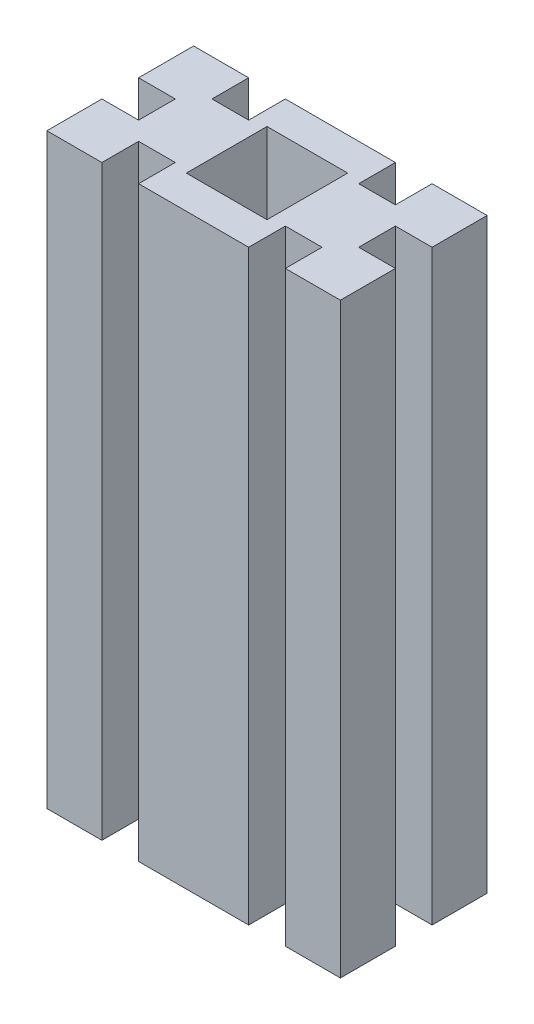
ISO-10303-21;
HEADER;
FILE_DESCRIPTION(('STEP AP214'),'2;1');
FILE_NAME('part.step','',(''),(''),'','','');
FILE_SCHEMA(('AUTOMOTIVE_DESIGN { 1 0 10303 214 1 1 1 1 }'));
ENDSEC;
DATA;
#1=APPLICATION_CONTEXT('core data for automotive mechanical design processes');
#2=APPLICATION_PROTOCOL_DEFINITION('international standard','automotive_design',2000,#1);
#3=PRODUCT_CONTEXT('',#1,'mechanical');
#4=PRODUCT('Part','Part','',(#3));
#5=PRODUCT_RELATED_PRODUCT_CATEGORY('part','',(#4));
#6=PRODUCT_DEFINITION_FORMATION('','',#4);
#7=PRODUCT_DEFINITION_CONTEXT('part definition',#1,'design');
#8=PRODUCT_DEFINITION('design','',#6,#7);
#9=PRODUCT_DEFINITION_SHAPE('','',#8);
#10=(LENGTH_UNIT() NAMED_UNIT(*) SI_UNIT(.MILLI.,.METRE.));
#11=(NAMED_UNIT(*) PLANE_ANGLE_UNIT() SI_UNIT($,.RADIAN.));
#12=(NAMED_UNIT(*) SI_UNIT($,.STERADIAN.) SOLID_ANGLE_UNIT());
#13=UNCERTAINTY_MEASURE_WITH_UNIT(LENGTH_MEASURE(1.E-05),#10,'distance_accuracy_value','');
#14=(GEOMETRIC_REPRESENTATION_CONTEXT(3) GLOBAL_UNCERTAINTY_ASSIGNED_CONTEXT((#13)) GLOBAL_UNIT_ASSIGNED_CONTEXT((#10,
#11,#12)) REPRESENTATION_CONTEXT('',''));
#15=CARTESIAN_POINT('',(0.,0.,0.));
#16=DIRECTION('',(0.,0.,1.));
#17=DIRECTION('',(1.,0.,0.));
#18=AXIS2_PLACEMENT_3D('',#15,#16,#17);
#19=CARTESIAN_POINT('',(-20.,80.,10.));
#20=DIRECTION('',(1.,0.,0.));
#21=DIRECTION('',(0.,0.,-1.));
#22=AXIS2_PLACEMENT_3D('',#19,#20,#21);
#23=PLANE('',#22);
#24=DIRECTION('',(0.,0.,1.));
#25=VECTOR('',#24,1.);
#26=CARTESIAN_POINT('',(-20.,0.,10.));
#27=LINE('',#26,#25);
#28=CARTESIAN_POINT('',(-20.,0.,-10.));
#29=VERTEX_POINT('',#28);
#30=CARTESIAN_POINT('',(-20.,0.,-2.5));
#31=VERTEX_POINT('',#30);
#32=EDGE_CURVE('E315',#29,#31,#27,.T.);
#33=ORIENTED_EDGE('',*,*,#32,.T.);
#34=DIRECTION('',(0.,1.,0.));
#35=VECTOR('',#34,1.);
#36=CARTESIAN_POINT('',(-20.,0.,-2.5));
#37=LINE('',#36,#35);
#38=CARTESIAN_POINT('',(-20.,80.,-2.5));
#39=VERTEX_POINT('',#38);
#40=EDGE_CURVE('E353',#31,#39,#37,.T.);
#41=ORIENTED_EDGE('',*,*,#40,.T.);
#42=DIRECTION('',(0.,0.,1.));
#43=VECTOR('',#42,1.);
#44=CARTESIAN_POINT('',(-20.,80.,10.));
#45=LINE('',#44,#43);
#46=CARTESIAN_POINT('',(-20.,80.,-10.));
#47=VERTEX_POINT('',#46);
#48=EDGE_CURVE('E334',#47,#39,#45,.T.);
#49=ORIENTED_EDGE('',*,*,#48,.F.);
#50=DIRECTION('',(0.,-1.,0.));
#51=VECTOR('',#50,1.);
#52=CARTESIAN_POINT('',(-20.,80.,-10.));
#53=LINE('',#52,#51);
#54=EDGE_CURVE('E278',#47,#29,#53,.T.);
#55=ORIENTED_EDGE('',*,*,#54,.T.);
#56=EDGE_LOOP('',(#33,#41,#49,#55));
#57=FACE_BOUND('',#56,.T.);
#58=ADVANCED_FACE('F32',(#57),#23,.F.);
#59=CARTESIAN_POINT('',(20.,80.,9.99999999999999));
#60=DIRECTION('',(0.,0.,-1.));
#61=DIRECTION('',(-1.,0.,0.));
#62=AXIS2_PLACEMENT_3D('',#59,#60,#61);
#63=PLANE('',#62);
#64=DIRECTION('',(1.,0.,0.));
#65=VECTOR('',#64,1.);
#66=CARTESIAN_POINT('',(20.,0.,9.99999999999999));
#67=LINE('',#66,#65);
#68=CARTESIAN_POINT('',(-20.,0.,10.));
#69=VERTEX_POINT('',#68);
#70=CARTESIAN_POINT('',(-12.5,0.,10.));
#71=VERTEX_POINT('',#70);
#72=EDGE_CURVE('E303',#69,#71,#67,.T.);
#73=ORIENTED_EDGE('',*,*,#72,.T.);
#74=DIRECTION('',(0.,1.,0.));
#75=VECTOR('',#74,1.);
#76=CARTESIAN_POINT('',(-12.5,0.,10.));
#77=LINE('',#76,#75);
#78=CARTESIAN_POINT('',(-12.5,80.,10.));
#79=VERTEX_POINT('',#78);
#80=EDGE_CURVE('E408',#71,#79,#77,.T.);
#81=ORIENTED_EDGE('',*,*,#80,.T.);
#82=DIRECTION('',(1.,0.,0.));
#83=VECTOR('',#82,1.);
#84=CARTESIAN_POINT('',(20.,80.,9.99999999999999));
#85=LINE('',#84,#83);
#86=CARTESIAN_POINT('',(-20.,80.,10.));
#87=VERTEX_POINT('',#86);
#88=EDGE_CURVE('E329',#87,#79,#85,.T.);
#89=ORIENTED_EDGE('',*,*,#88,.F.);
#90=DIRECTION('',(0.,-1.,0.));
#91=VECTOR('',#90,1.);
#92=CARTESIAN_POINT('',(-20.,80.,10.));
#93=LINE('',#92,#91);
#94=EDGE_CURVE('E11',#87,#69,#93,.T.);
#95=ORIENTED_EDGE('',*,*,#94,.T.);
#96=EDGE_LOOP('',(#73,#81,#89,#95));
#97=FACE_BOUND('',#96,.T.);
#98=ADVANCED_FACE('F546',(#97),#63,.F.);
#99=CARTESIAN_POINT('',(-7.5,80.,10.));
#100=VERTEX_POINT('',#99);
#101=CARTESIAN_POINT('',(7.5,80.,10.));
#102=VERTEX_POINT('',#101);
#103=EDGE_CURVE('E332',#100,#102,#85,.T.);
#104=ORIENTED_EDGE('',*,*,#103,.F.);
#105=DIRECTION('',(0.,1.,0.));
#106=VECTOR('',#105,1.);
#107=CARTESIAN_POINT('',(-7.5,0.,10.));
#108=LINE('',#107,#106);
#109=CARTESIAN_POINT('',(-7.5,0.,10.));
#110=VERTEX_POINT('',#109);
#111=EDGE_CURVE('E410',#110,#100,#108,.T.);
#112=ORIENTED_EDGE('',*,*,#111,.F.);
#113=CARTESIAN_POINT('',(7.5,0.,10.));
#114=VERTEX_POINT('',#113);
#115=EDGE_CURVE('E309',#110,#114,#67,.T.);
#116=ORIENTED_EDGE('',*,*,#115,.T.);
#117=DIRECTION('',(0.,1.,0.));
#118=VECTOR('',#117,1.);
#119=CARTESIAN_POINT('',(7.5,0.,10.));
#120=LINE('',#119,#118);
#121=EDGE_CURVE('E390',#114,#102,#120,.T.);
#122=ORIENTED_EDGE('',*,*,#121,.T.);
#123=EDGE_LOOP('',(#104,#112,#116,#122));
#124=FACE_BOUND('',#123,.T.);
#125=ADVANCED_FACE('F534',(#124),#63,.F.);
#126=CARTESIAN_POINT('',(20.,80.,9.99999999999999));
#127=DIRECTION('',(-1.,0.,0.));
#128=DIRECTION('',(0.,0.,1.));
#129=AXIS2_PLACEMENT_3D('',#126,#127,#128);
#130=PLANE('',#129);
#131=DIRECTION('',(0.,0.,-1.));
#132=VECTOR('',#131,1.);
#133=CARTESIAN_POINT('',(20.,80.,9.99999999999999));
#134=LINE('',#133,#132);
#135=CARTESIAN_POINT('',(20.,80.,-2.5));
#136=VERTEX_POINT('',#135);
#137=CARTESIAN_POINT('',(20.,80.,-10.));
#138=VERTEX_POINT('',#137);
#139=EDGE_CURVE('E328',#136,#138,#134,.T.);
#140=ORIENTED_EDGE('',*,*,#139,.F.);
#141=DIRECTION('',(0.,1.,0.));
#142=VECTOR('',#141,1.);
#143=CARTESIAN_POINT('',(20.,0.,-2.5));
#144=LINE('',#143,#142);
#145=CARTESIAN_POINT('',(20.,0.,-2.5));
#146=VERTEX_POINT('',#145);
#147=EDGE_CURVE('E365',#146,#136,#144,.T.);
#148=ORIENTED_EDGE('',*,*,#147,.F.);
#149=DIRECTION('',(0.,0.,-1.));
#150=VECTOR('',#149,1.);
#151=CARTESIAN_POINT('',(20.,0.,9.99999999999999));
#152=LINE('',#151,#150);
#153=CARTESIAN_POINT('',(20.,0.,-10.));
#154=VERTEX_POINT('',#153);
#155=EDGE_CURVE('E302',#146,#154,#152,.T.);
#156=ORIENTED_EDGE('',*,*,#155,.T.);
#157=DIRECTION('',(0.,-1.,0.));
#158=VECTOR('',#157,1.);
#159=CARTESIAN_POINT('',(20.,80.,-10.));
#160=LINE('',#159,#158);
#161=EDGE_CURVE('E281',#138,#154,#160,.T.);
#162=ORIENTED_EDGE('',*,*,#161,.F.);
#163=EDGE_LOOP('',(#140,#148,#156,#162));
#164=FACE_BOUND('',#163,.T.);
#165=ADVANCED_FACE('F515',(#164),#130,.F.);
#166=CARTESIAN_POINT('',(20.,80.,-10.));
#167=DIRECTION('',(0.,0.,1.));
#168=DIRECTION('',(1.,0.,0.));
#169=AXIS2_PLACEMENT_3D('',#166,#167,#168);
#170=PLANE('',#169);
#171=DIRECTION('',(-1.,0.,0.));
#172=VECTOR('',#171,1.);
#173=CARTESIAN_POINT('',(20.,0.,-10.));
#174=LINE('',#173,#172);
#175=CARTESIAN_POINT('',(12.5,0.,-10.));
#176=VERTEX_POINT('',#175);
#177=EDGE_CURVE('E269',#154,#176,#174,.T.);
#178=ORIENTED_EDGE('',*,*,#177,.T.);
#179=DIRECTION('',(0.,1.,0.));
#180=VECTOR('',#179,1.);
#181=CARTESIAN_POINT('',(12.5,0.,-10.));
#182=LINE('',#181,#180);
#183=CARTESIAN_POINT('',(12.5,80.,-10.));
#184=VERTEX_POINT('',#183);
#185=EDGE_CURVE('E377',#176,#184,#182,.T.);
#186=ORIENTED_EDGE('',*,*,#185,.T.);
#187=DIRECTION('',(-1.,0.,0.));
#188=VECTOR('',#187,1.);
#189=CARTESIAN_POINT('',(20.,80.,-10.));
#190=LINE('',#189,#188);
#191=EDGE_CURVE('E282',#138,#184,#190,.T.);
#192=ORIENTED_EDGE('',*,*,#191,.F.);
#193=ORIENTED_EDGE('',*,*,#161,.T.);
#194=EDGE_LOOP('',(#178,#186,#192,#193));
#195=FACE_BOUND('',#194,.T.);
#196=ADVANCED_FACE('F507',(#195),#170,.F.);
#197=CARTESIAN_POINT('',(-12.5,80.,-10.));
#198=VERTEX_POINT('',#197);
#199=EDGE_CURVE('E326',#198,#47,#190,.T.);
#200=ORIENTED_EDGE('',*,*,#199,.F.);
#201=DIRECTION('',(0.,1.,0.));
#202=VECTOR('',#201,1.);
#203=CARTESIAN_POINT('',(-12.5,0.,-10.));
#204=LINE('',#203,#202);
#205=CARTESIAN_POINT('',(-12.5,0.,-10.));
#206=VERTEX_POINT('',#205);
#207=EDGE_CURVE('E322',#206,#198,#204,.T.);
#208=ORIENTED_EDGE('',*,*,#207,.F.);
#209=EDGE_CURVE('E270',#206,#29,#174,.T.);
#210=ORIENTED_EDGE('',*,*,#209,.T.);
#211=ORIENTED_EDGE('',*,*,#54,.F.);
#212=EDGE_LOOP('',(#200,#208,#210,#211));
#213=FACE_BOUND('',#212,.T.);
#214=ADVANCED_FACE('F552',(#213),#170,.F.);
#215=CARTESIAN_POINT('',(-20.,80.,2.5));
#216=VERTEX_POINT('',#215);
#217=EDGE_CURVE('E273',#216,#87,#45,.T.);
#218=ORIENTED_EDGE('',*,*,#217,.F.);
#219=DIRECTION('',(0.,1.,0.));
#220=VECTOR('',#219,1.);
#221=CARTESIAN_POINT('',(-20.,0.,2.5));
#222=LINE('',#221,#220);
#223=CARTESIAN_POINT('',(-20.,0.,2.5));
#224=VERTEX_POINT('',#223);
#225=EDGE_CURVE('E433',#224,#216,#222,.T.);
#226=ORIENTED_EDGE('',*,*,#225,.F.);
#227=EDGE_CURVE('E318',#224,#69,#27,.T.);
#228=ORIENTED_EDGE('',*,*,#227,.T.);
#229=ORIENTED_EDGE('',*,*,#94,.F.);
#230=EDGE_LOOP('',(#218,#226,#228,#229));
#231=FACE_BOUND('',#230,.T.);
#232=ADVANCED_FACE('F34',(#231),#23,.F.);
#233=CARTESIAN_POINT('',(12.5,80.,10.));
#234=VERTEX_POINT('',#233);
#235=CARTESIAN_POINT('',(20.,80.,9.99999999999999));
#236=VERTEX_POINT('',#235);
#237=EDGE_CURVE('E333',#234,#236,#85,.T.);
#238=ORIENTED_EDGE('',*,*,#237,.F.);
#239=DIRECTION('',(0.,1.,0.));
#240=VECTOR('',#239,1.);
#241=CARTESIAN_POINT('',(12.5,0.,10.));
#242=LINE('',#241,#240);
#243=CARTESIAN_POINT('',(12.5,0.,10.));
#244=VERTEX_POINT('',#243);
#245=EDGE_CURVE('E383',#244,#234,#242,.T.);
#246=ORIENTED_EDGE('',*,*,#245,.F.);
#247=CARTESIAN_POINT('',(20.,0.,9.99999999999999));
#248=VERTEX_POINT('',#247);
#249=EDGE_CURVE('E299',#244,#248,#67,.T.);
#250=ORIENTED_EDGE('',*,*,#249,.T.);
#251=DIRECTION('',(0.,-1.,0.));
#252=VECTOR('',#251,1.);
#253=CARTESIAN_POINT('',(20.,80.,9.99999999999999));
#254=LINE('',#253,#252);
#255=EDGE_CURVE('E40',#236,#248,#254,.T.);
#256=ORIENTED_EDGE('',*,*,#255,.F.);
#257=EDGE_LOOP('',(#238,#246,#250,#256));
#258=FACE_BOUND('',#257,.T.);
#259=ADVANCED_FACE('F544',(#258),#63,.F.);
#260=CARTESIAN_POINT('',(20.,0.,2.5));
#261=VERTEX_POINT('',#260);
#262=EDGE_CURVE('E274',#248,#261,#152,.T.);
#263=ORIENTED_EDGE('',*,*,#262,.T.);
#264=DIRECTION('',(0.,1.,0.));
#265=VECTOR('',#264,1.);
#266=CARTESIAN_POINT('',(20.,0.,2.5));
#267=LINE('',#266,#265);
#268=CARTESIAN_POINT('',(20.,80.,2.5));
#269=VERTEX_POINT('',#268);
#270=EDGE_CURVE('E363',#261,#269,#267,.T.);
#271=ORIENTED_EDGE('',*,*,#270,.T.);
#272=EDGE_CURVE('E293',#236,#269,#134,.T.);
#273=ORIENTED_EDGE('',*,*,#272,.F.);
#274=ORIENTED_EDGE('',*,*,#255,.T.);
#275=EDGE_LOOP('',(#263,#271,#273,#274));
#276=FACE_BOUND('',#275,.T.);
#277=ADVANCED_FACE('F290',(#276),#130,.F.);
#278=CARTESIAN_POINT('',(7.50000000000001,80.,-10.));
#279=VERTEX_POINT('',#278);
#280=CARTESIAN_POINT('',(-7.50000000000001,80.,-10.));
#281=VERTEX_POINT('',#280);
#282=EDGE_CURVE('E261',#279,#281,#190,.T.);
#283=ORIENTED_EDGE('',*,*,#282,.F.);
#284=DIRECTION('',(0.,1.,0.));
#285=VECTOR('',#284,1.);
#286=CARTESIAN_POINT('',(7.50000000000001,0.,-10.));
#287=LINE('',#286,#285);
#288=CARTESIAN_POINT('',(7.50000000000001,0.,-10.));
#289=VERTEX_POINT('',#288);
#290=EDGE_CURVE('E245',#289,#279,#287,.T.);
#291=ORIENTED_EDGE('',*,*,#290,.F.);
#292=CARTESIAN_POINT('',(-7.50000000000001,0.,-10.));
#293=VERTEX_POINT('',#292);
#294=EDGE_CURVE('E259',#289,#293,#174,.T.);
#295=ORIENTED_EDGE('',*,*,#294,.T.);
#296=DIRECTION('',(0.,1.,0.));
#297=VECTOR('',#296,1.);
#298=CARTESIAN_POINT('',(-7.50000000000001,0.,-10.));
#299=LINE('',#298,#297);
#300=EDGE_CURVE('E341',#293,#281,#299,.T.);
#301=ORIENTED_EDGE('',*,*,#300,.T.);
#302=EDGE_LOOP('',(#283,#291,#295,#301));
#303=FACE_BOUND('',#302,.T.);
#304=ADVANCED_FACE('F257',(#303),#170,.F.);
#305=CARTESIAN_POINT('',(0.,80.,0.));
#306=DIRECTION('',(0.,1.,0.));
#307=DIRECTION('',(0.,0.,1.));
#308=AXIS2_PLACEMENT_3D('',#305,#306,#307);
#309=PLANE('',#308);
#310=DIRECTION('',(-1.,0.,0.));
#311=VECTOR('',#310,1.);
#312=CARTESIAN_POINT('',(-20.,80.,-2.5));
#313=LINE('',#312,#311);
#314=CARTESIAN_POINT('',(-15.,80.,-2.5));
#315=VERTEX_POINT('',#314);
#316=EDGE_CURVE('E441',#315,#39,#313,.T.);
#317=ORIENTED_EDGE('',*,*,#316,.F.);
#318=DIRECTION('',(0.,0.,-1.));
#319=VECTOR('',#318,1.);
#320=CARTESIAN_POINT('',(-15.,80.,-2.5));
#321=LINE('',#320,#319);
#322=CARTESIAN_POINT('',(-15.,80.,2.5));
#323=VERTEX_POINT('',#322);
#324=EDGE_CURVE('E444',#323,#315,#321,.T.);
#325=ORIENTED_EDGE('',*,*,#324,.F.);
#326=DIRECTION('',(1.,0.,0.));
#327=VECTOR('',#326,1.);
#328=CARTESIAN_POINT('',(-20.,80.,2.5));
#329=LINE('',#328,#327);
#330=EDGE_CURVE('E417',#216,#323,#329,.T.);
#331=ORIENTED_EDGE('',*,*,#330,.F.);
#332=ORIENTED_EDGE('',*,*,#217,.T.);
#333=ORIENTED_EDGE('',*,*,#88,.T.);
#334=DIRECTION('',(0.,0.,1.));
#335=VECTOR('',#334,1.);
#336=CARTESIAN_POINT('',(-12.5,80.,10.));
#337=LINE('',#336,#335);
#338=CARTESIAN_POINT('',(-12.5,80.,5.));
#339=VERTEX_POINT('',#338);
#340=EDGE_CURVE('E393',#339,#79,#337,.T.);
#341=ORIENTED_EDGE('',*,*,#340,.F.);
#342=DIRECTION('',(-1.,0.,0.));
#343=VECTOR('',#342,1.);
#344=CARTESIAN_POINT('',(-12.5,80.,5.));
#345=LINE('',#344,#343);
#346=CARTESIAN_POINT('',(-7.5,80.,5.));
#347=VERTEX_POINT('',#346);
#348=EDGE_CURVE('E418',#347,#339,#345,.T.);
#349=ORIENTED_EDGE('',*,*,#348,.F.);
#350=DIRECTION('',(0.,0.,-1.));
#351=VECTOR('',#350,1.);
#352=CARTESIAN_POINT('',(-7.5,80.,10.));
#353=LINE('',#352,#351);
#354=EDGE_CURVE('E422',#100,#347,#353,.T.);
#355=ORIENTED_EDGE('',*,*,#354,.F.);
#356=ORIENTED_EDGE('',*,*,#103,.T.);
#357=DIRECTION('',(0.,0.,1.));
#358=VECTOR('',#357,1.);
#359=CARTESIAN_POINT('',(7.5,80.,10.));
#360=LINE('',#359,#358);
#361=CARTESIAN_POINT('',(7.5,80.,5.));
#362=VERTEX_POINT('',#361);
#363=EDGE_CURVE('E394',#362,#102,#360,.T.);
#364=ORIENTED_EDGE('',*,*,#363,.F.);
#365=DIRECTION('',(-1.,0.,0.));
#366=VECTOR('',#365,1.);
#367=CARTESIAN_POINT('',(12.5,80.,5.));
#368=LINE('',#367,#366);
#369=CARTESIAN_POINT('',(12.5,80.,5.));
#370=VERTEX_POINT('',#369);
#371=EDGE_CURVE('E397',#370,#362,#368,.T.);
#372=ORIENTED_EDGE('',*,*,#371,.F.);
#373=DIRECTION('',(0.,0.,-1.));
#374=VECTOR('',#373,1.);
#375=CARTESIAN_POINT('',(12.5,80.,10.));
#376=LINE('',#375,#374);
#377=EDGE_CURVE('E367',#234,#370,#376,.T.);
#378=ORIENTED_EDGE('',*,*,#377,.F.);
#379=ORIENTED_EDGE('',*,*,#237,.T.);
#380=ORIENTED_EDGE('',*,*,#272,.T.);
#381=DIRECTION('',(1.,0.,0.));
#382=VECTOR('',#381,1.);
#383=CARTESIAN_POINT('',(20.,80.,2.5));
#384=LINE('',#383,#382);
#385=CARTESIAN_POINT('',(15.,80.,2.5));
#386=VERTEX_POINT('',#385);
#387=EDGE_CURVE('E368',#386,#269,#384,.T.);
#388=ORIENTED_EDGE('',*,*,#387,.F.);
#389=DIRECTION('',(0.,0.,1.));
#390=VECTOR('',#389,1.);
#391=CARTESIAN_POINT('',(15.,80.,-2.5));
#392=LINE('',#391,#390);
#393=CARTESIAN_POINT('',(15.,80.,-2.5));
#394=VERTEX_POINT('',#393);
#395=EDGE_CURVE('E371',#394,#386,#392,.T.);
#396=ORIENTED_EDGE('',*,*,#395,.F.);
#397=DIRECTION('',(-1.,0.,0.));
#398=VECTOR('',#397,1.);
#399=CARTESIAN_POINT('',(20.,80.,-2.5));
#400=LINE('',#399,#398);
#401=EDGE_CURVE('E374',#136,#394,#400,.T.);
#402=ORIENTED_EDGE('',*,*,#401,.F.);
#403=ORIENTED_EDGE('',*,*,#139,.T.);
#404=ORIENTED_EDGE('',*,*,#191,.T.);
#405=DIRECTION('',(0.,0.,-1.));
#406=VECTOR('',#405,1.);
#407=CARTESIAN_POINT('',(12.5,80.,-10.));
#408=LINE('',#407,#406);
#409=CARTESIAN_POINT('',(12.5,80.,-5.00000000000001));
#410=VERTEX_POINT('',#409);
#411=EDGE_CURVE('E252',#410,#184,#408,.T.);
#412=ORIENTED_EDGE('',*,*,#411,.F.);
#413=DIRECTION('',(1.,0.,0.));
#414=VECTOR('',#413,1.);
#415=CARTESIAN_POINT('',(12.5,80.,-5.00000000000001));
#416=LINE('',#415,#414);
#417=CARTESIAN_POINT('',(7.5,80.,-5.00000000000001));
#418=VERTEX_POINT('',#417);
#419=EDGE_CURVE('E491',#418,#410,#416,.T.);
#420=ORIENTED_EDGE('',*,*,#419,.F.);
#421=DIRECTION('',(0.,0.,1.));
#422=VECTOR('',#421,1.);
#423=CARTESIAN_POINT('',(7.50000000000001,80.,-10.));
#424=LINE('',#423,#422);
#425=EDGE_CURVE('E463',#279,#418,#424,.T.);
#426=ORIENTED_EDGE('',*,*,#425,.F.);
#427=ORIENTED_EDGE('',*,*,#282,.T.);
#428=DIRECTION('',(0.,0.,-1.));
#429=VECTOR('',#428,1.);
#430=CARTESIAN_POINT('',(-7.50000000000001,80.,-10.));
#431=LINE('',#430,#429);
#432=CARTESIAN_POINT('',(-7.5,80.,-5.00000000000001));
#433=VERTEX_POINT('',#432);
#434=EDGE_CURVE('E344',#433,#281,#431,.T.);
#435=ORIENTED_EDGE('',*,*,#434,.F.);
#436=DIRECTION('',(1.,0.,0.));
#437=VECTOR('',#436,1.);
#438=CARTESIAN_POINT('',(-12.5,80.,-5.00000000000001));
#439=LINE('',#438,#437);
#440=CARTESIAN_POINT('',(-12.5,80.,-5.00000000000001));
#441=VERTEX_POINT('',#440);
#442=EDGE_CURVE('E347',#441,#433,#439,.T.);
#443=ORIENTED_EDGE('',*,*,#442,.F.);
#444=DIRECTION('',(0.,0.,1.));
#445=VECTOR('',#444,1.);
#446=CARTESIAN_POINT('',(-12.5,80.,-10.));
#447=LINE('',#446,#445);
#448=EDGE_CURVE('E350',#198,#441,#447,.T.);
#449=ORIENTED_EDGE('',*,*,#448,.F.);
#450=ORIENTED_EDGE('',*,*,#199,.T.);
#451=ORIENTED_EDGE('',*,*,#48,.T.);
#452=EDGE_LOOP('',(#317,#325,#331,#332,#333,#341,#349,#355,#356,#364,#372,#378,#379,#380,#388,
#396,#402,#403,#404,#412,#420,#426,#427,#435,#443,#449,#450,#451));
#453=FACE_BOUND('',#452,.T.);
#454=DIRECTION('',(0.,0.,1.));
#455=VECTOR('',#454,1.);
#456=CARTESIAN_POINT('',(-5.5,80.,-5.5));
#457=LINE('',#456,#455);
#458=CARTESIAN_POINT('',(-5.5,80.,-5.5));
#459=VERTEX_POINT('',#458);
#460=CARTESIAN_POINT('',(-5.5,80.,5.5));
#461=VERTEX_POINT('',#460);
#462=EDGE_CURVE('E47',#459,#461,#457,.T.);
#463=ORIENTED_EDGE('',*,*,#462,.F.);
#464=DIRECTION('',(-1.,0.,0.));
#465=VECTOR('',#464,1.);
#466=CARTESIAN_POINT('',(5.5,80.,-5.5));
#467=LINE('',#466,#465);
#468=CARTESIAN_POINT('',(5.5,80.,-5.5));
#469=VERTEX_POINT('',#468);
#470=EDGE_CURVE('E464',#469,#459,#467,.T.);
#471=ORIENTED_EDGE('',*,*,#470,.F.);
#472=DIRECTION('',(0.,0.,-1.));
#473=VECTOR('',#472,1.);
#474=CARTESIAN_POINT('',(5.5,80.,-5.5));
#475=LINE('',#474,#473);
#476=CARTESIAN_POINT('',(5.5,80.,5.5));
#477=VERTEX_POINT('',#476);
#478=EDGE_CURVE('E468',#477,#469,#475,.T.);
#479=ORIENTED_EDGE('',*,*,#478,.F.);
#480=DIRECTION('',(1.,0.,0.));
#481=VECTOR('',#480,1.);
#482=CARTESIAN_POINT('',(5.5,80.,5.5));
#483=LINE('',#482,#481);
#484=EDGE_CURVE('E471',#461,#477,#483,.T.);
#485=ORIENTED_EDGE('',*,*,#484,.F.);
#486=EDGE_LOOP('',(#463,#471,#479,#485));
#487=FACE_BOUND('',#486,.T.);
#488=ADVANCED_FACE('F510',(#453,#487),#309,.T.);
#489=CARTESIAN_POINT('',(0.,0.,0.));
#490=DIRECTION('',(0.,1.,0.));
#491=DIRECTION('',(0.,0.,1.));
#492=AXIS2_PLACEMENT_3D('',#489,#490,#491);
#493=PLANE('',#492);
#494=DIRECTION('',(0.,0.,-1.));
#495=VECTOR('',#494,1.);
#496=CARTESIAN_POINT('',(-15.,0.,-2.5));
#497=LINE('',#496,#495);
#498=CARTESIAN_POINT('',(-15.,0.,2.5));
#499=VERTEX_POINT('',#498);
#500=CARTESIAN_POINT('',(-15.,0.,-2.5));
#501=VERTEX_POINT('',#500);
#502=EDGE_CURVE('E55',#499,#501,#497,.T.);
#503=ORIENTED_EDGE('',*,*,#502,.T.);
#504=DIRECTION('',(-1.,0.,0.));
#505=VECTOR('',#504,1.);
#506=CARTESIAN_POINT('',(-20.,0.,-2.5));
#507=LINE('',#506,#505);
#508=EDGE_CURVE('E436',#501,#31,#507,.T.);
#509=ORIENTED_EDGE('',*,*,#508,.T.);
#510=ORIENTED_EDGE('',*,*,#32,.F.);
#511=ORIENTED_EDGE('',*,*,#209,.F.);
#512=DIRECTION('',(0.,0.,1.));
#513=VECTOR('',#512,1.);
#514=CARTESIAN_POINT('',(-12.5,0.,-10.));
#515=LINE('',#514,#513);
#516=CARTESIAN_POINT('',(-12.5,0.,-5.00000000000001));
#517=VERTEX_POINT('',#516);
#518=EDGE_CURVE('E346',#206,#517,#515,.T.);
#519=ORIENTED_EDGE('',*,*,#518,.T.);
#520=DIRECTION('',(1.,0.,0.));
#521=VECTOR('',#520,1.);
#522=CARTESIAN_POINT('',(-12.5,0.,-5.00000000000001));
#523=LINE('',#522,#521);
#524=CARTESIAN_POINT('',(-7.5,0.,-5.00000000000001));
#525=VERTEX_POINT('',#524);
#526=EDGE_CURVE('E355',#517,#525,#523,.T.);
#527=ORIENTED_EDGE('',*,*,#526,.T.);
#528=DIRECTION('',(0.,0.,-1.));
#529=VECTOR('',#528,1.);
#530=CARTESIAN_POINT('',(-7.50000000000001,0.,-10.));
#531=LINE('',#530,#529);
#532=EDGE_CURVE('E268',#525,#293,#531,.T.);
#533=ORIENTED_EDGE('',*,*,#532,.T.);
#534=ORIENTED_EDGE('',*,*,#294,.F.);
#535=DIRECTION('',(0.,0.,1.));
#536=VECTOR('',#535,1.);
#537=CARTESIAN_POINT('',(7.50000000000001,0.,-10.));
#538=LINE('',#537,#536);
#539=CARTESIAN_POINT('',(7.5,0.,-5.00000000000001));
#540=VERTEX_POINT('',#539);
#541=EDGE_CURVE('E241',#289,#540,#538,.T.);
#542=ORIENTED_EDGE('',*,*,#541,.T.);
#543=DIRECTION('',(1.,0.,0.));
#544=VECTOR('',#543,1.);
#545=CARTESIAN_POINT('',(12.5,0.,-5.00000000000001));
#546=LINE('',#545,#544);
#547=CARTESIAN_POINT('',(12.5,0.,-5.00000000000001));
#548=VERTEX_POINT('',#547);
#549=EDGE_CURVE('E251',#540,#548,#546,.T.);
#550=ORIENTED_EDGE('',*,*,#549,.T.);
#551=DIRECTION('',(0.,0.,-1.));
#552=VECTOR('',#551,1.);
#553=CARTESIAN_POINT('',(12.5,0.,-10.));
#554=LINE('',#553,#552);
#555=EDGE_CURVE('E262',#548,#176,#554,.T.);
#556=ORIENTED_EDGE('',*,*,#555,.T.);
#557=ORIENTED_EDGE('',*,*,#177,.F.);
#558=ORIENTED_EDGE('',*,*,#155,.F.);
#559=DIRECTION('',(-1.,0.,0.));
#560=VECTOR('',#559,1.);
#561=CARTESIAN_POINT('',(20.,0.,-2.5));
#562=LINE('',#561,#560);
#563=CARTESIAN_POINT('',(15.,0.,-2.5));
#564=VERTEX_POINT('',#563);
#565=EDGE_CURVE('E370',#146,#564,#562,.T.);
#566=ORIENTED_EDGE('',*,*,#565,.T.);
#567=DIRECTION('',(0.,0.,1.));
#568=VECTOR('',#567,1.);
#569=CARTESIAN_POINT('',(15.,0.,-2.5));
#570=LINE('',#569,#568);
#571=CARTESIAN_POINT('',(15.,0.,2.5));
#572=VERTEX_POINT('',#571);
#573=EDGE_CURVE('E379',#564,#572,#570,.T.);
#574=ORIENTED_EDGE('',*,*,#573,.T.);
#575=DIRECTION('',(1.,0.,0.));
#576=VECTOR('',#575,1.);
#577=CARTESIAN_POINT('',(20.,0.,2.5));
#578=LINE('',#577,#576);
#579=EDGE_CURVE('E301',#572,#261,#578,.T.);
#580=ORIENTED_EDGE('',*,*,#579,.T.);
#581=ORIENTED_EDGE('',*,*,#262,.F.);
#582=ORIENTED_EDGE('',*,*,#249,.F.);
#583=DIRECTION('',(0.,0.,-1.));
#584=VECTOR('',#583,1.);
#585=CARTESIAN_POINT('',(12.5,0.,10.));
#586=LINE('',#585,#584);
#587=CARTESIAN_POINT('',(12.5,0.,5.));
#588=VERTEX_POINT('',#587);
#589=EDGE_CURVE('E396',#244,#588,#586,.T.);
#590=ORIENTED_EDGE('',*,*,#589,.T.);
#591=DIRECTION('',(-1.,0.,0.));
#592=VECTOR('',#591,1.);
#593=CARTESIAN_POINT('',(12.5,0.,5.));
#594=LINE('',#593,#592);
#595=CARTESIAN_POINT('',(7.5,0.,5.));
#596=VERTEX_POINT('',#595);
#597=EDGE_CURVE('E404',#588,#596,#594,.T.);
#598=ORIENTED_EDGE('',*,*,#597,.T.);
#599=DIRECTION('',(0.,0.,1.));
#600=VECTOR('',#599,1.);
#601=CARTESIAN_POINT('',(7.5,0.,10.));
#602=LINE('',#601,#600);
#603=EDGE_CURVE('E386',#596,#114,#602,.T.);
#604=ORIENTED_EDGE('',*,*,#603,.T.);
#605=ORIENTED_EDGE('',*,*,#115,.F.);
#606=DIRECTION('',(0.,0.,-1.));
#607=VECTOR('',#606,1.);
#608=CARTESIAN_POINT('',(-7.5,0.,10.));
#609=LINE('',#608,#607);
#610=CARTESIAN_POINT('',(-7.5,0.,5.));
#611=VERTEX_POINT('',#610);
#612=EDGE_CURVE('E428',#110,#611,#609,.T.);
#613=ORIENTED_EDGE('',*,*,#612,.T.);
#614=DIRECTION('',(-1.,0.,0.));
#615=VECTOR('',#614,1.);
#616=CARTESIAN_POINT('',(-12.5,0.,5.));
#617=LINE('',#616,#615);
#618=CARTESIAN_POINT('',(-12.5,0.,5.));
#619=VERTEX_POINT('',#618);
#620=EDGE_CURVE('E411',#611,#619,#617,.T.);
#621=ORIENTED_EDGE('',*,*,#620,.T.);
#622=DIRECTION('',(0.,0.,1.));
#623=VECTOR('',#622,1.);
#624=CARTESIAN_POINT('',(-12.5,0.,10.));
#625=LINE('',#624,#623);
#626=EDGE_CURVE('E421',#619,#71,#625,.T.);
#627=ORIENTED_EDGE('',*,*,#626,.T.);
#628=ORIENTED_EDGE('',*,*,#72,.F.);
#629=ORIENTED_EDGE('',*,*,#227,.F.);
#630=DIRECTION('',(1.,0.,0.));
#631=VECTOR('',#630,1.);
#632=CARTESIAN_POINT('',(-20.,0.,2.5));
#633=LINE('',#632,#631);
#634=EDGE_CURVE('E443',#224,#499,#633,.T.);
#635=ORIENTED_EDGE('',*,*,#634,.T.);
#636=EDGE_LOOP('',(#503,#509,#510,#511,#519,#527,#533,#534,#542,#550,#556,#557,#558,#566,#574,
#580,#581,#582,#590,#598,#604,#605,#613,#621,#627,#628,#629,#635));
#637=FACE_BOUND('',#636,.T.);
#638=DIRECTION('',(-1.,0.,0.));
#639=VECTOR('',#638,1.);
#640=CARTESIAN_POINT('',(5.5,0.,-5.5));
#641=LINE('',#640,#639);
#642=CARTESIAN_POINT('',(5.5,0.,-5.5));
#643=VERTEX_POINT('',#642);
#644=CARTESIAN_POINT('',(-5.5,0.,-5.5));
#645=VERTEX_POINT('',#644);
#646=EDGE_CURVE('E457',#643,#645,#641,.T.);
#647=ORIENTED_EDGE('',*,*,#646,.T.);
#648=DIRECTION('',(0.,0.,1.));
#649=VECTOR('',#648,1.);
#650=CARTESIAN_POINT('',(-5.5,0.,-5.5));
#651=LINE('',#650,#649);
#652=CARTESIAN_POINT('',(-5.5,0.,5.5));
#653=VERTEX_POINT('',#652);
#654=EDGE_CURVE('E467',#645,#653,#651,.T.);
#655=ORIENTED_EDGE('',*,*,#654,.T.);
#656=DIRECTION('',(1.,0.,0.));
#657=VECTOR('',#656,1.);
#658=CARTESIAN_POINT('',(5.5,0.,5.5));
#659=LINE('',#658,#657);
#660=CARTESIAN_POINT('',(5.5,0.,5.5));
#661=VERTEX_POINT('',#660);
#662=EDGE_CURVE('E480',#653,#661,#659,.T.);
#663=ORIENTED_EDGE('',*,*,#662,.T.);
#664=DIRECTION('',(0.,0.,-1.));
#665=VECTOR('',#664,1.);
#666=CARTESIAN_POINT('',(5.5,0.,-5.5));
#667=LINE('',#666,#665);
#668=EDGE_CURVE('E477',#661,#643,#667,.T.);
#669=ORIENTED_EDGE('',*,*,#668,.T.);
#670=EDGE_LOOP('',(#647,#655,#663,#669));
#671=FACE_BOUND('',#670,.T.);
#672=ADVANCED_FACE('F265',(#637,#671),#493,.F.);
#673=CARTESIAN_POINT('',(-12.5,0.,-10.));
#674=DIRECTION('',(-1.,0.,0.));
#675=DIRECTION('',(0.,0.,1.));
#676=AXIS2_PLACEMENT_3D('',#673,#674,#675);
#677=PLANE('',#676);
#678=ORIENTED_EDGE('',*,*,#448,.T.);
#679=DIRECTION('',(0.,1.,0.));
#680=VECTOR('',#679,1.);
#681=CARTESIAN_POINT('',(-12.5,0.,-5.00000000000001));
#682=LINE('',#681,#680);
#683=EDGE_CURVE('E337',#517,#441,#682,.T.);
#684=ORIENTED_EDGE('',*,*,#683,.F.);
#685=ORIENTED_EDGE('',*,*,#518,.F.);
#686=ORIENTED_EDGE('',*,*,#207,.T.);
#687=EDGE_LOOP('',(#678,#684,#685,#686));
#688=FACE_BOUND('',#687,.T.);
#689=ADVANCED_FACE('F622',(#688),#677,.F.);
#690=CARTESIAN_POINT('',(-7.50000000000001,0.,-10.));
#691=DIRECTION('',(1.,0.,0.));
#692=DIRECTION('',(0.,0.,-1.));
#693=AXIS2_PLACEMENT_3D('',#690,#691,#692);
#694=PLANE('',#693);
#695=ORIENTED_EDGE('',*,*,#434,.T.);
#696=ORIENTED_EDGE('',*,*,#300,.F.);
#697=ORIENTED_EDGE('',*,*,#532,.F.);
#698=DIRECTION('',(0.,1.,0.));
#699=VECTOR('',#698,1.);
#700=CARTESIAN_POINT('',(-7.5,0.,-5.00000000000001));
#701=LINE('',#700,#699);
#702=EDGE_CURVE('E339',#525,#433,#701,.T.);
#703=ORIENTED_EDGE('',*,*,#702,.T.);
#704=EDGE_LOOP('',(#695,#696,#697,#703));
#705=FACE_BOUND('',#704,.T.);
#706=ADVANCED_FACE('F631',(#705),#694,.F.);
#707=CARTESIAN_POINT('',(-12.5,0.,-5.00000000000001));
#708=DIRECTION('',(0.,0.,1.));
#709=DIRECTION('',(1.,0.,0.));
#710=AXIS2_PLACEMENT_3D('',#707,#708,#709);
#711=PLANE('',#710);
#712=ORIENTED_EDGE('',*,*,#442,.T.);
#713=ORIENTED_EDGE('',*,*,#702,.F.);
#714=ORIENTED_EDGE('',*,*,#526,.F.);
#715=ORIENTED_EDGE('',*,*,#683,.T.);
#716=EDGE_LOOP('',(#712,#713,#714,#715));
#717=FACE_BOUND('',#716,.T.);
#718=ADVANCED_FACE('F641',(#717),#711,.F.);
#719=CARTESIAN_POINT('',(-5.5,0.,-5.5));
#720=DIRECTION('',(-1.,0.,0.));
#721=DIRECTION('',(0.,0.,1.));
#722=AXIS2_PLACEMENT_3D('',#719,#720,#721);
#723=PLANE('',#722);
#724=ORIENTED_EDGE('',*,*,#462,.T.);
#725=DIRECTION('',(0.,1.,0.));
#726=VECTOR('',#725,1.);
#727=CARTESIAN_POINT('',(-5.5,0.,5.5));
#728=LINE('',#727,#726);
#729=EDGE_CURVE('E454',#653,#461,#728,.T.);
#730=ORIENTED_EDGE('',*,*,#729,.F.);
#731=ORIENTED_EDGE('',*,*,#654,.F.);
#732=DIRECTION('',(0.,1.,0.));
#733=VECTOR('',#732,1.);
#734=CARTESIAN_POINT('',(-5.5,0.,-5.5));
#735=LINE('',#734,#733);
#736=EDGE_CURVE('E461',#645,#459,#735,.T.);
#737=ORIENTED_EDGE('',*,*,#736,.T.);
#738=EDGE_LOOP('',(#724,#730,#731,#737));
#739=FACE_BOUND('',#738,.T.);
#740=ADVANCED_FACE('F651',(#739),#723,.F.);
#741=CARTESIAN_POINT('',(5.5,0.,-5.5));
#742=DIRECTION('',(0.,0.,-1.));
#743=DIRECTION('',(-1.,0.,0.));
#744=AXIS2_PLACEMENT_3D('',#741,#742,#743);
#745=PLANE('',#744);
#746=ORIENTED_EDGE('',*,*,#470,.T.);
#747=ORIENTED_EDGE('',*,*,#736,.F.);
#748=ORIENTED_EDGE('',*,*,#646,.F.);
#749=DIRECTION('',(0.,1.,0.));
#750=VECTOR('',#749,1.);
#751=CARTESIAN_POINT('',(5.5,0.,-5.5));
#752=LINE('',#751,#750);
#753=EDGE_CURVE('E459',#643,#469,#752,.T.);
#754=ORIENTED_EDGE('',*,*,#753,.T.);
#755=EDGE_LOOP('',(#746,#747,#748,#754));
#756=FACE_BOUND('',#755,.T.);
#757=ADVANCED_FACE('F661',(#756),#745,.F.);
#758=CARTESIAN_POINT('',(5.5,0.,-5.5));
#759=DIRECTION('',(1.,0.,0.));
#760=DIRECTION('',(0.,0.,-1.));
#761=AXIS2_PLACEMENT_3D('',#758,#759,#760);
#762=PLANE('',#761);
#763=ORIENTED_EDGE('',*,*,#478,.T.);
#764=ORIENTED_EDGE('',*,*,#753,.F.);
#765=ORIENTED_EDGE('',*,*,#668,.F.);
#766=DIRECTION('',(0.,1.,0.));
#767=VECTOR('',#766,1.);
#768=CARTESIAN_POINT('',(5.5,0.,5.5));
#769=LINE('',#768,#767);
#770=EDGE_CURVE('E456',#661,#477,#769,.T.);
#771=ORIENTED_EDGE('',*,*,#770,.T.);
#772=EDGE_LOOP('',(#763,#764,#765,#771));
#773=FACE_BOUND('',#772,.T.);
#774=ADVANCED_FACE('F670',(#773),#762,.F.);
#775=CARTESIAN_POINT('',(5.5,0.,5.5));
#776=DIRECTION('',(0.,0.,1.));
#777=DIRECTION('',(1.,0.,0.));
#778=AXIS2_PLACEMENT_3D('',#775,#776,#777);
#779=PLANE('',#778);
#780=ORIENTED_EDGE('',*,*,#484,.T.);
#781=ORIENTED_EDGE('',*,*,#770,.F.);
#782=ORIENTED_EDGE('',*,*,#662,.F.);
#783=ORIENTED_EDGE('',*,*,#729,.T.);
#784=EDGE_LOOP('',(#780,#781,#782,#783));
#785=FACE_BOUND('',#784,.T.);
#786=ADVANCED_FACE('F680',(#785),#779,.F.);
#787=CARTESIAN_POINT('',(12.5,0.,-10.));
#788=DIRECTION('',(1.,0.,0.));
#789=DIRECTION('',(0.,0.,-1.));
#790=AXIS2_PLACEMENT_3D('',#787,#788,#789);
#791=PLANE('',#790);
#792=ORIENTED_EDGE('',*,*,#411,.T.);
#793=ORIENTED_EDGE('',*,*,#185,.F.);
#794=ORIENTED_EDGE('',*,*,#555,.F.);
#795=DIRECTION('',(0.,1.,0.));
#796=VECTOR('',#795,1.);
#797=CARTESIAN_POINT('',(12.5,0.,-5.00000000000001));
#798=LINE('',#797,#796);
#799=EDGE_CURVE('E486',#548,#410,#798,.T.);
#800=ORIENTED_EDGE('',*,*,#799,.T.);
#801=EDGE_LOOP('',(#792,#793,#794,#800));
#802=FACE_BOUND('',#801,.T.);
#803=ADVANCED_FACE('F504',(#802),#791,.F.);
#804=CARTESIAN_POINT('',(12.5,0.,-5.00000000000001));
#805=DIRECTION('',(0.,0.,1.));
#806=DIRECTION('',(1.,0.,0.));
#807=AXIS2_PLACEMENT_3D('',#804,#805,#806);
#808=PLANE('',#807);
#809=ORIENTED_EDGE('',*,*,#419,.T.);
#810=ORIENTED_EDGE('',*,*,#799,.F.);
#811=ORIENTED_EDGE('',*,*,#549,.F.);
#812=DIRECTION('',(0.,1.,0.));
#813=VECTOR('',#812,1.);
#814=CARTESIAN_POINT('',(7.5,0.,-5.00000000000001));
#815=LINE('',#814,#813);
#816=EDGE_CURVE('E247',#540,#418,#815,.T.);
#817=ORIENTED_EDGE('',*,*,#816,.T.);
#818=EDGE_LOOP('',(#809,#810,#811,#817));
#819=FACE_BOUND('',#818,.T.);
#820=ADVANCED_FACE('F500',(#819),#808,.F.);
#821=CARTESIAN_POINT('',(7.50000000000001,0.,-10.));
#822=DIRECTION('',(-1.,0.,0.));
#823=DIRECTION('',(0.,0.,1.));
#824=AXIS2_PLACEMENT_3D('',#821,#822,#823);
#825=PLANE('',#824);
#826=ORIENTED_EDGE('',*,*,#425,.T.);
#827=ORIENTED_EDGE('',*,*,#816,.F.);
#828=ORIENTED_EDGE('',*,*,#541,.F.);
#829=ORIENTED_EDGE('',*,*,#290,.T.);
#830=EDGE_LOOP('',(#826,#827,#828,#829));
#831=FACE_BOUND('',#830,.T.);
#832=ADVANCED_FACE('F244',(#831),#825,.F.);
#833=CARTESIAN_POINT('',(20.,0.,-2.5));
#834=DIRECTION('',(0.,0.,-1.));
#835=DIRECTION('',(-1.,0.,0.));
#836=AXIS2_PLACEMENT_3D('',#833,#834,#835);
#837=PLANE('',#836);
#838=ORIENTED_EDGE('',*,*,#401,.T.);
#839=DIRECTION('',(0.,1.,0.));
#840=VECTOR('',#839,1.);
#841=CARTESIAN_POINT('',(15.,0.,-2.5));
#842=LINE('',#841,#840);
#843=EDGE_CURVE('E359',#564,#394,#842,.T.);
#844=ORIENTED_EDGE('',*,*,#843,.F.);
#845=ORIENTED_EDGE('',*,*,#565,.F.);
#846=ORIENTED_EDGE('',*,*,#147,.T.);
#847=EDGE_LOOP('',(#838,#844,#845,#846));
#848=FACE_BOUND('',#847,.T.);
#849=ADVANCED_FACE('F518',(#848),#837,.F.);
#850=CARTESIAN_POINT('',(20.,0.,2.5));
#851=DIRECTION('',(0.,0.,1.));
#852=DIRECTION('',(1.,0.,0.));
#853=AXIS2_PLACEMENT_3D('',#850,#851,#852);
#854=PLANE('',#853);
#855=ORIENTED_EDGE('',*,*,#387,.T.);
#856=ORIENTED_EDGE('',*,*,#270,.F.);
#857=ORIENTED_EDGE('',*,*,#579,.F.);
#858=DIRECTION('',(0.,1.,0.));
#859=VECTOR('',#858,1.);
#860=CARTESIAN_POINT('',(15.,0.,2.5));
#861=LINE('',#860,#859);
#862=EDGE_CURVE('E361',#572,#386,#861,.T.);
#863=ORIENTED_EDGE('',*,*,#862,.T.);
#864=EDGE_LOOP('',(#855,#856,#857,#863));
#865=FACE_BOUND('',#864,.T.);
#866=ADVANCED_FACE('F524',(#865),#854,.F.);
#867=CARTESIAN_POINT('',(15.,0.,-2.5));
#868=DIRECTION('',(-1.,0.,0.));
#869=DIRECTION('',(0.,0.,1.));
#870=AXIS2_PLACEMENT_3D('',#867,#868,#869);
#871=PLANE('',#870);
#872=ORIENTED_EDGE('',*,*,#395,.T.);
#873=ORIENTED_EDGE('',*,*,#862,.F.);
#874=ORIENTED_EDGE('',*,*,#573,.F.);
#875=ORIENTED_EDGE('',*,*,#843,.T.);
#876=EDGE_LOOP('',(#872,#873,#874,#875));
#877=FACE_BOUND('',#876,.T.);
#878=ADVANCED_FACE('F521',(#877),#871,.F.);
#879=CARTESIAN_POINT('',(7.5,0.,10.));
#880=DIRECTION('',(-1.,0.,0.));
#881=DIRECTION('',(0.,0.,1.));
#882=AXIS2_PLACEMENT_3D('',#879,#880,#881);
#883=PLANE('',#882);
#884=ORIENTED_EDGE('',*,*,#363,.T.);
#885=ORIENTED_EDGE('',*,*,#121,.F.);
#886=ORIENTED_EDGE('',*,*,#603,.F.);
#887=DIRECTION('',(0.,1.,0.));
#888=VECTOR('',#887,1.);
#889=CARTESIAN_POINT('',(7.5,0.,5.));
#890=LINE('',#889,#888);
#891=EDGE_CURVE('E388',#596,#362,#890,.T.);
#892=ORIENTED_EDGE('',*,*,#891,.T.);
#893=EDGE_LOOP('',(#884,#885,#886,#892));
#894=FACE_BOUND('',#893,.T.);
#895=ADVANCED_FACE('F538',(#894),#883,.F.);
#896=CARTESIAN_POINT('',(12.5,0.,5.));
#897=DIRECTION('',(0.,0.,-1.));
#898=DIRECTION('',(-1.,0.,0.));
#899=AXIS2_PLACEMENT_3D('',#896,#897,#898);
#900=PLANE('',#899);
#901=ORIENTED_EDGE('',*,*,#371,.T.);
#902=ORIENTED_EDGE('',*,*,#891,.F.);
#903=ORIENTED_EDGE('',*,*,#597,.F.);
#904=DIRECTION('',(0.,1.,0.));
#905=VECTOR('',#904,1.);
#906=CARTESIAN_POINT('',(12.5,0.,5.));
#907=LINE('',#906,#905);
#908=EDGE_CURVE('E385',#588,#370,#907,.T.);
#909=ORIENTED_EDGE('',*,*,#908,.T.);
#910=EDGE_LOOP('',(#901,#902,#903,#909));
#911=FACE_BOUND('',#910,.T.);
#912=ADVANCED_FACE('F541',(#911),#900,.F.);
#913=CARTESIAN_POINT('',(12.5,0.,10.));
#914=DIRECTION('',(1.,0.,0.));
#915=DIRECTION('',(0.,0.,-1.));
#916=AXIS2_PLACEMENT_3D('',#913,#914,#915);
#917=PLANE('',#916);
#918=ORIENTED_EDGE('',*,*,#377,.T.);
#919=ORIENTED_EDGE('',*,*,#908,.F.);
#920=ORIENTED_EDGE('',*,*,#589,.F.);
#921=ORIENTED_EDGE('',*,*,#245,.T.);
#922=EDGE_LOOP('',(#918,#919,#920,#921));
#923=FACE_BOUND('',#922,.T.);
#924=ADVANCED_FACE('F543',(#923),#917,.F.);
#925=CARTESIAN_POINT('',(-12.5,0.,10.));
#926=DIRECTION('',(-1.,0.,0.));
#927=DIRECTION('',(0.,0.,1.));
#928=AXIS2_PLACEMENT_3D('',#925,#926,#927);
#929=PLANE('',#928);
#930=ORIENTED_EDGE('',*,*,#340,.T.);
#931=ORIENTED_EDGE('',*,*,#80,.F.);
#932=ORIENTED_EDGE('',*,*,#626,.F.);
#933=DIRECTION('',(0.,1.,0.));
#934=VECTOR('',#933,1.);
#935=CARTESIAN_POINT('',(-12.5,0.,5.));
#936=LINE('',#935,#934);
#937=EDGE_CURVE('E415',#619,#339,#936,.T.);
#938=ORIENTED_EDGE('',*,*,#937,.T.);
#939=EDGE_LOOP('',(#930,#931,#932,#938));
#940=FACE_BOUND('',#939,.T.);
#941=ADVANCED_FACE('F763',(#940),#929,.F.);
#942=CARTESIAN_POINT('',(-12.5,0.,5.));
#943=DIRECTION('',(0.,0.,-1.));
#944=DIRECTION('',(-1.,0.,0.));
#945=AXIS2_PLACEMENT_3D('',#942,#943,#944);
#946=PLANE('',#945);
#947=ORIENTED_EDGE('',*,*,#348,.T.);
#948=ORIENTED_EDGE('',*,*,#937,.F.);
#949=ORIENTED_EDGE('',*,*,#620,.F.);
#950=DIRECTION('',(0.,1.,0.));
#951=VECTOR('',#950,1.);
#952=CARTESIAN_POINT('',(-7.5,0.,5.));
#953=LINE('',#952,#951);
#954=EDGE_CURVE('E413',#611,#347,#953,.T.);
#955=ORIENTED_EDGE('',*,*,#954,.T.);
#956=EDGE_LOOP('',(#947,#948,#949,#955));
#957=FACE_BOUND('',#956,.T.);
#958=ADVANCED_FACE('F772',(#957),#946,.F.);
#959=CARTESIAN_POINT('',(-7.5,0.,10.));
#960=DIRECTION('',(1.,0.,0.));
#961=DIRECTION('',(0.,0.,-1.));
#962=AXIS2_PLACEMENT_3D('',#959,#960,#961);
#963=PLANE('',#962);
#964=ORIENTED_EDGE('',*,*,#354,.T.);
#965=ORIENTED_EDGE('',*,*,#954,.F.);
#966=ORIENTED_EDGE('',*,*,#612,.F.);
#967=ORIENTED_EDGE('',*,*,#111,.T.);
#968=EDGE_LOOP('',(#964,#965,#966,#967));
#969=FACE_BOUND('',#968,.T.);
#970=ADVANCED_FACE('F782',(#969),#963,.F.);
#971=CARTESIAN_POINT('',(-20.,0.,-2.5));
#972=DIRECTION('',(0.,0.,-1.));
#973=DIRECTION('',(-1.,0.,0.));
#974=AXIS2_PLACEMENT_3D('',#971,#972,#973);
#975=PLANE('',#974);
#976=ORIENTED_EDGE('',*,*,#316,.T.);
#977=ORIENTED_EDGE('',*,*,#40,.F.);
#978=ORIENTED_EDGE('',*,*,#508,.F.);
#979=DIRECTION('',(0.,1.,0.));
#980=VECTOR('',#979,1.);
#981=CARTESIAN_POINT('',(-15.,0.,-2.5));
#982=LINE('',#981,#980);
#983=EDGE_CURVE('E438',#501,#315,#982,.T.);
#984=ORIENTED_EDGE('',*,*,#983,.T.);
#985=EDGE_LOOP('',(#976,#977,#978,#984));
#986=FACE_BOUND('',#985,.T.);
#987=ADVANCED_FACE('F792',(#986),#975,.F.);
#988=CARTESIAN_POINT('',(-15.,0.,-2.5));
#989=DIRECTION('',(1.,0.,0.));
#990=DIRECTION('',(0.,0.,-1.));
#991=AXIS2_PLACEMENT_3D('',#988,#989,#990);
#992=PLANE('',#991);
#993=ORIENTED_EDGE('',*,*,#324,.T.);
#994=ORIENTED_EDGE('',*,*,#983,.F.);
#995=ORIENTED_EDGE('',*,*,#502,.F.);
#996=DIRECTION('',(0.,1.,0.));
#997=VECTOR('',#996,1.);
#998=CARTESIAN_POINT('',(-15.,0.,2.5));
#999=LINE('',#998,#997);
#1000=EDGE_CURVE('E435',#499,#323,#999,.T.);
#1001=ORIENTED_EDGE('',*,*,#1000,.T.);
#1002=EDGE_LOOP('',(#993,#994,#995,#1001));
#1003=FACE_BOUND('',#1002,.T.);
#1004=ADVANCED_FACE('F802',(#1003),#992,.F.);
#1005=CARTESIAN_POINT('',(-20.,0.,2.5));
#1006=DIRECTION('',(0.,0.,1.));
#1007=DIRECTION('',(1.,0.,0.));
#1008=AXIS2_PLACEMENT_3D('',#1005,#1006,#1007);
#1009=PLANE('',#1008);
#1010=ORIENTED_EDGE('',*,*,#330,.T.);
#1011=ORIENTED_EDGE('',*,*,#1000,.F.);
#1012=ORIENTED_EDGE('',*,*,#634,.F.);
#1013=ORIENTED_EDGE('',*,*,#225,.T.);
#1014=EDGE_LOOP('',(#1010,#1011,#1012,#1013));
#1015=FACE_BOUND('',#1014,.T.);
#1016=ADVANCED_FACE('F812',(#1015),#1009,.F.);
#1017=CLOSED_SHELL('',(#58,#98,#125,#165,#196,#214,#232,#259,#277,#304,#488,#672,#689,#706,#718,
#740,#757,#774,#786,#803,#820,#832,#849,#866,#878,#895,#912,#924,#941,#958,#970,#987,#1004,#1016));
#1018=MANIFOLD_SOLID_BREP('B2',#1017);
#1019=ADVANCED_BREP_SHAPE_REPRESENTATION('',(#18,#1018),#14);
#1020=SHAPE_DEFINITION_REPRESENTATION(#9,#1019);
ENDSEC;
END-ISO-10303-21;
